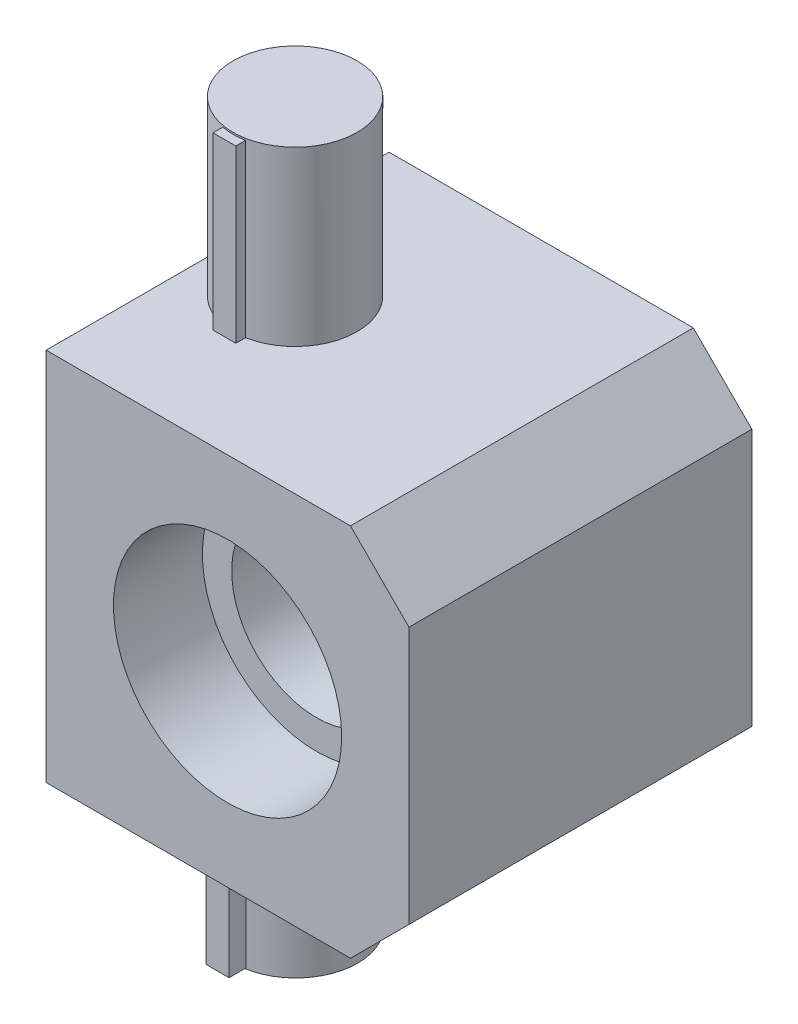
ISO-10303-21;
HEADER;
FILE_DESCRIPTION(('STEP AP214'),'2;1');
FILE_NAME('part.step','',(''),(''),'','','');
FILE_SCHEMA(('AUTOMOTIVE_DESIGN { 1 0 10303 214 1 1 1 1 }'));
ENDSEC;
DATA;
#1=APPLICATION_CONTEXT('core data for automotive mechanical design processes');
#2=APPLICATION_PROTOCOL_DEFINITION('international standard','automotive_design',2000,#1);
#3=PRODUCT_CONTEXT('',#1,'mechanical');
#4=PRODUCT('Part','Part','',(#3));
#5=PRODUCT_RELATED_PRODUCT_CATEGORY('part','',(#4));
#6=PRODUCT_DEFINITION_FORMATION('','',#4);
#7=PRODUCT_DEFINITION_CONTEXT('part definition',#1,'design');
#8=PRODUCT_DEFINITION('design','',#6,#7);
#9=PRODUCT_DEFINITION_SHAPE('','',#8);
#10=(LENGTH_UNIT() NAMED_UNIT(*) SI_UNIT(.MILLI.,.METRE.));
#11=(NAMED_UNIT(*) PLANE_ANGLE_UNIT() SI_UNIT($,.RADIAN.));
#12=(NAMED_UNIT(*) SI_UNIT($,.STERADIAN.) SOLID_ANGLE_UNIT());
#13=UNCERTAINTY_MEASURE_WITH_UNIT(LENGTH_MEASURE(1.E-05),#10,'distance_accuracy_value','');
#14=(GEOMETRIC_REPRESENTATION_CONTEXT(3) GLOBAL_UNCERTAINTY_ASSIGNED_CONTEXT((#13)) GLOBAL_UNIT_ASSIGNED_CONTEXT((#10,
#11,#12)) REPRESENTATION_CONTEXT('',''));
#15=CARTESIAN_POINT('',(0.,0.,0.));
#16=DIRECTION('',(0.,0.,1.));
#17=DIRECTION('',(1.,0.,0.));
#18=AXIS2_PLACEMENT_3D('',#15,#16,#17);
#19=CARTESIAN_POINT('',(3.1,-3.2,5.86));
#20=DIRECTION('',(0.,1.,0.));
#21=DIRECTION('',(-1.,0.,0.));
#22=AXIS2_PLACEMENT_3D('',#19,#20,#21);
#23=PLANE('',#22);
#24=DIRECTION('',(1.,0.,0.));
#25=VECTOR('',#24,1.);
#26=CARTESIAN_POINT('',(3.1,-3.2,0.));
#27=LINE('',#26,#25);
#28=CARTESIAN_POINT('',(-3.1,-3.2,0.));
#29=VERTEX_POINT('',#28);
#30=CARTESIAN_POINT('',(2.1,-3.2,0.));
#31=VERTEX_POINT('',#30);
#32=EDGE_CURVE('E258',#29,#31,#27,.T.);
#33=ORIENTED_EDGE('',*,*,#32,.T.);
#34=DIRECTION('',(0.,0.,1.));
#35=VECTOR('',#34,1.);
#36=CARTESIAN_POINT('',(2.1,-3.2,5.86));
#37=LINE('',#36,#35);
#38=CARTESIAN_POINT('',(2.1,-3.2,5.86));
#39=VERTEX_POINT('',#38);
#40=EDGE_CURVE('E223',#31,#39,#37,.T.);
#41=ORIENTED_EDGE('',*,*,#40,.T.);
#42=DIRECTION('',(1.,0.,0.));
#43=VECTOR('',#42,1.);
#44=CARTESIAN_POINT('',(3.1,-3.2,5.86));
#45=LINE('',#44,#43);
#46=CARTESIAN_POINT('',(-3.1,-3.2,5.86));
#47=VERTEX_POINT('',#46);
#48=EDGE_CURVE('E242',#47,#39,#45,.T.);
#49=ORIENTED_EDGE('',*,*,#48,.F.);
#50=DIRECTION('',(0.,0.,-1.));
#51=VECTOR('',#50,1.);
#52=CARTESIAN_POINT('',(-3.1,-3.2,5.86));
#53=LINE('',#52,#51);
#54=EDGE_CURVE('E271',#47,#29,#53,.T.);
#55=ORIENTED_EDGE('',*,*,#54,.T.);
#56=EDGE_LOOP('',(#33,#41,#49,#55));
#57=FACE_BOUND('',#56,.T.);
#58=DIRECTION('',(0.,0.,1.));
#59=VECTOR('',#58,1.);
#60=CARTESIAN_POINT('',(-1.56905023754,-3.2,3.71555524248292));
#61=LINE('',#60,#59);
#62=CARTESIAN_POINT('',(-1.56905023754,-3.2,3.97270153096788));
#63=VERTEX_POINT('',#62);
#64=CARTESIAN_POINT('',(-1.56905023754,-3.2,4.26602920930463));
#65=VERTEX_POINT('',#64);
#66=EDGE_CURVE('E170',#63,#65,#61,.T.);
#67=ORIENTED_EDGE('',*,*,#66,.F.);
#68=CARTESIAN_POINT('',(-1.76405023754,-3.2,2.93079222589378));
#69=DIRECTION('',(0.,-1.,0.));
#70=DIRECTION('',(1.,0.,0.));
#71=AXIS2_PLACEMENT_3D('',#68,#69,#70);
#72=CIRCLE('',#71,1.06);
#73=CARTESIAN_POINT('',(-1.95905023754,-3.2,3.97270153096788));
#74=VERTEX_POINT('',#73);
#75=EDGE_CURVE('E185',#74,#63,#72,.T.);
#76=ORIENTED_EDGE('',*,*,#75,.F.);
#77=DIRECTION('',(0.,0.,1.));
#78=VECTOR('',#77,1.);
#79=CARTESIAN_POINT('',(-1.95905023754,-3.2,3.71555524248292));
#80=LINE('',#79,#78);
#81=CARTESIAN_POINT('',(-1.95905023754,-3.2,4.26602920930463));
#82=VERTEX_POINT('',#81);
#83=EDGE_CURVE('E61',#74,#82,#80,.T.);
#84=ORIENTED_EDGE('',*,*,#83,.T.);
#85=DIRECTION('',(-1.,0.,0.));
#86=VECTOR('',#85,1.);
#87=CARTESIAN_POINT('',(-1.56905023754,-3.2,4.26602920930463));
#88=LINE('',#87,#86);
#89=EDGE_CURVE('E66',#65,#82,#88,.T.);
#90=ORIENTED_EDGE('',*,*,#89,.F.);
#91=EDGE_LOOP('',(#67,#76,#84,#90));
#92=FACE_BOUND('',#91,.T.);
#93=ADVANCED_FACE('F50',(#57,#92),#23,.F.);
#94=CARTESIAN_POINT('',(3.1,3.2,5.86));
#95=DIRECTION('',(0.,-1.,0.));
#96=DIRECTION('',(1.,0.,0.));
#97=AXIS2_PLACEMENT_3D('',#94,#95,#96);
#98=PLANE('',#97);
#99=DIRECTION('',(-1.,0.,0.));
#100=VECTOR('',#99,1.);
#101=CARTESIAN_POINT('',(3.1,3.2,5.86));
#102=LINE('',#101,#100);
#103=CARTESIAN_POINT('',(2.1,3.2,5.86));
#104=VERTEX_POINT('',#103);
#105=CARTESIAN_POINT('',(-3.1,3.2,5.86));
#106=VERTEX_POINT('',#105);
#107=EDGE_CURVE('E254',#104,#106,#102,.T.);
#108=ORIENTED_EDGE('',*,*,#107,.F.);
#109=DIRECTION('',(0.,0.,-1.));
#110=VECTOR('',#109,1.);
#111=CARTESIAN_POINT('',(2.1,3.2,5.86));
#112=LINE('',#111,#110);
#113=CARTESIAN_POINT('',(2.1,3.2,0.));
#114=VERTEX_POINT('',#113);
#115=EDGE_CURVE('E280',#104,#114,#112,.T.);
#116=ORIENTED_EDGE('',*,*,#115,.T.);
#117=DIRECTION('',(-1.,0.,0.));
#118=VECTOR('',#117,1.);
#119=CARTESIAN_POINT('',(3.1,3.2,0.));
#120=LINE('',#119,#118);
#121=CARTESIAN_POINT('',(-3.1,3.2,0.));
#122=VERTEX_POINT('',#121);
#123=EDGE_CURVE('E244',#114,#122,#120,.T.);
#124=ORIENTED_EDGE('',*,*,#123,.T.);
#125=DIRECTION('',(0.,0.,-1.));
#126=VECTOR('',#125,1.);
#127=CARTESIAN_POINT('',(-3.1,3.2,5.86));
#128=LINE('',#127,#126);
#129=EDGE_CURVE('E257',#106,#122,#128,.T.);
#130=ORIENTED_EDGE('',*,*,#129,.F.);
#131=EDGE_LOOP('',(#108,#116,#124,#130));
#132=FACE_BOUND('',#131,.T.);
#133=DIRECTION('',(0.,0.,-1.));
#134=VECTOR('',#133,1.);
#135=CARTESIAN_POINT('',(-1.5809854320758,3.2,3.84239832086676));
#136=LINE('',#135,#134);
#137=CARTESIAN_POINT('',(-1.5809854320758,3.2,4.13760167913324));
#138=VERTEX_POINT('',#137);
#139=CARTESIAN_POINT('',(-1.5809854320758,3.2,3.9719093050741));
#140=VERTEX_POINT('',#139);
#141=EDGE_CURVE('E180',#138,#140,#136,.T.);
#142=ORIENTED_EDGE('',*,*,#141,.F.);
#143=DIRECTION('',(1.,0.,0.));
#144=VECTOR('',#143,1.);
#145=CARTESIAN_POINT('',(-1.9709854320758,3.2,4.13760167913324));
#146=LINE('',#145,#144);
#147=CARTESIAN_POINT('',(-1.9709854320758,3.2,4.13760167913324));
#148=VERTEX_POINT('',#147);
#149=EDGE_CURVE('E195',#148,#138,#146,.T.);
#150=ORIENTED_EDGE('',*,*,#149,.F.);
#151=DIRECTION('',(0.,0.,1.));
#152=VECTOR('',#151,1.);
#153=CARTESIAN_POINT('',(-1.9709854320758,3.2,3.84239832086676));
#154=LINE('',#153,#152);
#155=CARTESIAN_POINT('',(-1.9709854320758,3.2,3.9719093050741));
#156=VERTEX_POINT('',#155);
#157=EDGE_CURVE('E201',#156,#148,#154,.T.);
#158=ORIENTED_EDGE('',*,*,#157,.F.);
#159=CARTESIAN_POINT('',(-1.7759854320758,3.2,2.93));
#160=DIRECTION('',(0.,1.,0.));
#161=DIRECTION('',(-1.,0.,0.));
#162=AXIS2_PLACEMENT_3D('',#159,#160,#161);
#163=CIRCLE('',#162,1.06);
#164=EDGE_CURVE('E219',#140,#156,#163,.T.);
#165=ORIENTED_EDGE('',*,*,#164,.F.);
#166=EDGE_LOOP('',(#142,#150,#158,#165));
#167=FACE_BOUND('',#166,.T.);
#168=ADVANCED_FACE('F330',(#132,#167),#98,.F.);
#169=CARTESIAN_POINT('',(-1.7759854320758,6.15,2.93));
#170=DIRECTION('',(0.,-1.,0.));
#171=DIRECTION('',(1.,0.,0.));
#172=AXIS2_PLACEMENT_3D('',#169,#170,#171);
#173=CYLINDRICAL_SURFACE('',#172,1.06);
#174=CARTESIAN_POINT('',(-1.7759854320758,6.15,2.93));
#175=DIRECTION('',(0.,1.,0.));
#176=DIRECTION('',(-1.,0.,0.));
#177=AXIS2_PLACEMENT_3D('',#174,#175,#176);
#178=CIRCLE('',#177,1.06);
#179=CARTESIAN_POINT('',(-2.8359854320758,6.15,2.93));
#180=VERTEX_POINT('',#179);
#181=EDGE_CURVE('E214',#180,#180,#178,.T.);
#182=ORIENTED_EDGE('',*,*,#181,.F.);
#183=EDGE_LOOP('',(#182));
#184=FACE_BOUND('',#183,.T.);
#185=DIRECTION('',(0.,-1.,0.));
#186=VECTOR('',#185,1.);
#187=CARTESIAN_POINT('',(-1.5809854320758,6.15,3.9719093050741));
#188=LINE('',#187,#186);
#189=CARTESIAN_POINT('',(-1.5809854320758,6.12,3.9719093050741));
#190=VERTEX_POINT('',#189);
#191=EDGE_CURVE('E190',#140,#190,#188,.F.);
#192=ORIENTED_EDGE('',*,*,#191,.F.);
#193=ORIENTED_EDGE('',*,*,#164,.T.);
#194=DIRECTION('',(0.,-1.,0.));
#195=VECTOR('',#194,1.);
#196=CARTESIAN_POINT('',(-1.9709854320758,6.15,3.9719093050741));
#197=LINE('',#196,#195);
#198=CARTESIAN_POINT('',(-1.9709854320758,6.12,3.9719093050741));
#199=VERTEX_POINT('',#198);
#200=EDGE_CURVE('E304',#199,#156,#197,.T.);
#201=ORIENTED_EDGE('',*,*,#200,.F.);
#202=CARTESIAN_POINT('',(-1.7759854320758,6.12,2.93));
#203=DIRECTION('',(0.,1.,0.));
#204=DIRECTION('',(0.,0.,1.));
#205=AXIS2_PLACEMENT_3D('',#202,#203,#204);
#206=CIRCLE('',#205,1.06);
#207=EDGE_CURVE('E225',#199,#190,#206,.T.);
#208=ORIENTED_EDGE('',*,*,#207,.T.);
#209=EDGE_LOOP('',(#192,#193,#201,#208));
#210=FACE_BOUND('',#209,.T.);
#211=ADVANCED_FACE('F334',(#184,#210),#173,.T.);
#212=CARTESIAN_POINT('',(-3.1,3.2,5.86));
#213=DIRECTION('',(1.,0.,0.));
#214=DIRECTION('',(0.,1.,0.));
#215=AXIS2_PLACEMENT_3D('',#212,#213,#214);
#216=PLANE('',#215);
#217=DIRECTION('',(0.,-1.,0.));
#218=VECTOR('',#217,1.);
#219=CARTESIAN_POINT('',(-3.1,3.2,0.));
#220=LINE('',#219,#218);
#221=EDGE_CURVE('E236',#122,#29,#220,.T.);
#222=ORIENTED_EDGE('',*,*,#221,.T.);
#223=ORIENTED_EDGE('',*,*,#54,.F.);
#224=DIRECTION('',(0.,-1.,0.));
#225=VECTOR('',#224,1.);
#226=CARTESIAN_POINT('',(-3.1,3.2,5.86));
#227=LINE('',#226,#225);
#228=EDGE_CURVE('E239',#106,#47,#227,.T.);
#229=ORIENTED_EDGE('',*,*,#228,.F.);
#230=ORIENTED_EDGE('',*,*,#129,.T.);
#231=EDGE_LOOP('',(#222,#223,#229,#230));
#232=FACE_BOUND('',#231,.T.);
#233=ADVANCED_FACE('F342',(#232),#216,.F.);
#234=CARTESIAN_POINT('',(3.1,3.2,5.86));
#235=DIRECTION('',(-1.,0.,0.));
#236=DIRECTION('',(0.,-1.,0.));
#237=AXIS2_PLACEMENT_3D('',#234,#235,#236);
#238=PLANE('',#237);
#239=DIRECTION('',(0.,1.,0.));
#240=VECTOR('',#239,1.);
#241=CARTESIAN_POINT('',(3.1,3.2,0.));
#242=LINE('',#241,#240);
#243=CARTESIAN_POINT('',(3.1,-2.2,0.));
#244=VERTEX_POINT('',#243);
#245=CARTESIAN_POINT('',(3.1,2.2,0.));
#246=VERTEX_POINT('',#245);
#247=EDGE_CURVE('E261',#244,#246,#242,.T.);
#248=ORIENTED_EDGE('',*,*,#247,.T.);
#249=DIRECTION('',(0.,0.,1.));
#250=VECTOR('',#249,1.);
#251=CARTESIAN_POINT('',(3.1,2.2,5.86));
#252=LINE('',#251,#250);
#253=CARTESIAN_POINT('',(3.1,2.2,5.86));
#254=VERTEX_POINT('',#253);
#255=EDGE_CURVE('E293',#246,#254,#252,.T.);
#256=ORIENTED_EDGE('',*,*,#255,.T.);
#257=DIRECTION('',(0.,1.,0.));
#258=VECTOR('',#257,1.);
#259=CARTESIAN_POINT('',(3.1,3.2,5.86));
#260=LINE('',#259,#258);
#261=CARTESIAN_POINT('',(3.1,-2.2,5.86));
#262=VERTEX_POINT('',#261);
#263=EDGE_CURVE('E248',#262,#254,#260,.T.);
#264=ORIENTED_EDGE('',*,*,#263,.F.);
#265=DIRECTION('',(0.,0.,-1.));
#266=VECTOR('',#265,1.);
#267=CARTESIAN_POINT('',(3.1,-2.2,5.86));
#268=LINE('',#267,#266);
#269=EDGE_CURVE('E290',#262,#244,#268,.T.);
#270=ORIENTED_EDGE('',*,*,#269,.T.);
#271=EDGE_LOOP('',(#248,#256,#264,#270));
#272=FACE_BOUND('',#271,.T.);
#273=ADVANCED_FACE('F338',(#272),#238,.F.);
#274=CARTESIAN_POINT('',(0.,0.,5.86));
#275=DIRECTION('',(0.,0.,-1.));
#276=DIRECTION('',(-1.,0.,0.));
#277=AXIS2_PLACEMENT_3D('',#274,#275,#276);
#278=PLANE('',#277);
#279=CARTESIAN_POINT('',(0.,0.,5.86));
#280=DIRECTION('',(0.,0.,1.));
#281=DIRECTION('',(1.,0.,0.));
#282=AXIS2_PLACEMENT_3D('',#279,#280,#281);
#283=CIRCLE('',#282,1.95);
#284=CARTESIAN_POINT('',(1.95,0.,5.86));
#285=VERTEX_POINT('',#284);
#286=EDGE_CURVE('E226',#285,#285,#283,.T.);
#287=ORIENTED_EDGE('',*,*,#286,.F.);
#288=EDGE_LOOP('',(#287));
#289=FACE_BOUND('',#288,.T.);
#290=ORIENTED_EDGE('',*,*,#263,.T.);
#291=DIRECTION('',(0.707106781186546,-0.707106781186549,0.));
#292=VECTOR('',#291,1.);
#293=CARTESIAN_POINT('',(2.1,3.2,5.86));
#294=LINE('',#293,#292);
#295=EDGE_CURVE('E300',#254,#104,#294,.F.);
#296=ORIENTED_EDGE('',*,*,#295,.T.);
#297=ORIENTED_EDGE('',*,*,#107,.T.);
#298=ORIENTED_EDGE('',*,*,#228,.T.);
#299=ORIENTED_EDGE('',*,*,#48,.T.);
#300=DIRECTION('',(-0.707106781186548,-0.707106781186547,0.));
#301=VECTOR('',#300,1.);
#302=CARTESIAN_POINT('',(3.1,-2.2,5.86));
#303=LINE('',#302,#301);
#304=EDGE_CURVE('E295',#39,#262,#303,.F.);
#305=ORIENTED_EDGE('',*,*,#304,.T.);
#306=EDGE_LOOP('',(#290,#296,#297,#298,#299,#305));
#307=FACE_BOUND('',#306,.T.);
#308=ADVANCED_FACE('F356',(#289,#307),#278,.F.);
#309=CARTESIAN_POINT('',(0.,0.,0.));
#310=DIRECTION('',(0.,0.,-1.));
#311=DIRECTION('',(-1.,0.,0.));
#312=AXIS2_PLACEMENT_3D('',#309,#310,#311);
#313=PLANE('',#312);
#314=CARTESIAN_POINT('',(0.,0.,0.));
#315=DIRECTION('',(0.,0.,1.));
#316=DIRECTION('',(1.,0.,0.));
#317=AXIS2_PLACEMENT_3D('',#314,#315,#316);
#318=CIRCLE('',#317,1.45);
#319=CARTESIAN_POINT('',(1.45,0.,0.));
#320=VERTEX_POINT('',#319);
#321=EDGE_CURVE('E222',#320,#320,#318,.T.);
#322=ORIENTED_EDGE('',*,*,#321,.T.);
#323=EDGE_LOOP('',(#322));
#324=FACE_BOUND('',#323,.T.);
#325=ORIENTED_EDGE('',*,*,#123,.F.);
#326=DIRECTION('',(-0.707106781186546,0.707106781186549,0.));
#327=VECTOR('',#326,1.);
#328=CARTESIAN_POINT('',(2.65,2.64999999999999,0.));
#329=LINE('',#328,#327);
#330=EDGE_CURVE('E281',#114,#246,#329,.F.);
#331=ORIENTED_EDGE('',*,*,#330,.T.);
#332=ORIENTED_EDGE('',*,*,#247,.F.);
#333=DIRECTION('',(0.707106781186548,0.707106781186547,0.));
#334=VECTOR('',#333,1.);
#335=CARTESIAN_POINT('',(2.65,-2.65,0.));
#336=LINE('',#335,#334);
#337=EDGE_CURVE('E282',#244,#31,#336,.F.);
#338=ORIENTED_EDGE('',*,*,#337,.T.);
#339=ORIENTED_EDGE('',*,*,#32,.F.);
#340=ORIENTED_EDGE('',*,*,#221,.F.);
#341=EDGE_LOOP('',(#325,#331,#332,#338,#339,#340));
#342=FACE_BOUND('',#341,.T.);
#343=ADVANCED_FACE('F346',(#324,#342),#313,.T.);
#344=CARTESIAN_POINT('',(2.1,3.2,5.86));
#345=DIRECTION('',(-0.707106781186549,-0.707106781186546,0.));
#346=DIRECTION('',(0.,0.,-1.));
#347=AXIS2_PLACEMENT_3D('',#344,#345,#346);
#348=PLANE('',#347);
#349=ORIENTED_EDGE('',*,*,#295,.F.);
#350=ORIENTED_EDGE('',*,*,#255,.F.);
#351=ORIENTED_EDGE('',*,*,#330,.F.);
#352=ORIENTED_EDGE('',*,*,#115,.F.);
#353=EDGE_LOOP('',(#349,#350,#351,#352));
#354=FACE_BOUND('',#353,.T.);
#355=ADVANCED_FACE('F343',(#354),#348,.F.);
#356=CARTESIAN_POINT('',(3.1,-2.2,5.86));
#357=DIRECTION('',(-0.707106781186547,0.707106781186548,0.));
#358=DIRECTION('',(0.,0.,-1.));
#359=AXIS2_PLACEMENT_3D('',#356,#357,#358);
#360=PLANE('',#359);
#361=ORIENTED_EDGE('',*,*,#304,.F.);
#362=ORIENTED_EDGE('',*,*,#40,.F.);
#363=ORIENTED_EDGE('',*,*,#337,.F.);
#364=ORIENTED_EDGE('',*,*,#269,.F.);
#365=EDGE_LOOP('',(#361,#362,#363,#364));
#366=FACE_BOUND('',#365,.T.);
#367=ADVANCED_FACE('F49',(#366),#360,.F.);
#368=CARTESIAN_POINT('',(0.,0.,4.34));
#369=DIRECTION('',(0.,0.,1.));
#370=DIRECTION('',(1.,0.,0.));
#371=AXIS2_PLACEMENT_3D('',#368,#369,#370);
#372=CYLINDRICAL_SURFACE('',#371,1.95);
#373=CARTESIAN_POINT('',(0.,0.,4.34));
#374=DIRECTION('',(0.,0.,1.));
#375=DIRECTION('',(1.,0.,0.));
#376=AXIS2_PLACEMENT_3D('',#373,#374,#375);
#377=CIRCLE('',#376,1.95);
#378=CARTESIAN_POINT('',(1.95,0.,4.34));
#379=VERTEX_POINT('',#378);
#380=EDGE_CURVE('E235',#379,#379,#377,.T.);
#381=ORIENTED_EDGE('',*,*,#380,.F.);
#382=EDGE_LOOP('',(#381));
#383=FACE_BOUND('',#382,.T.);
#384=ORIENTED_EDGE('',*,*,#286,.T.);
#385=EDGE_LOOP('',(#384));
#386=FACE_BOUND('',#385,.T.);
#387=ADVANCED_FACE('F354',(#383,#386),#372,.F.);
#388=CARTESIAN_POINT('',(0.,0.,4.34));
#389=DIRECTION('',(0.,0.,1.));
#390=DIRECTION('',(1.,0.,0.));
#391=AXIS2_PLACEMENT_3D('',#388,#389,#390);
#392=PLANE('',#391);
#393=CARTESIAN_POINT('',(0.,0.,4.34));
#394=DIRECTION('',(0.,0.,1.));
#395=DIRECTION('',(1.,0.,0.));
#396=AXIS2_PLACEMENT_3D('',#393,#394,#395);
#397=CIRCLE('',#396,1.45);
#398=CARTESIAN_POINT('',(1.45,0.,4.34));
#399=VERTEX_POINT('',#398);
#400=EDGE_CURVE('E220',#399,#399,#397,.T.);
#401=ORIENTED_EDGE('',*,*,#400,.F.);
#402=EDGE_LOOP('',(#401));
#403=FACE_BOUND('',#402,.T.);
#404=ORIENTED_EDGE('',*,*,#380,.T.);
#405=EDGE_LOOP('',(#404));
#406=FACE_BOUND('',#405,.T.);
#407=ADVANCED_FACE('F388',(#403,#406),#392,.T.);
#408=CARTESIAN_POINT('',(0.,0.,0.));
#409=DIRECTION('',(0.,0.,1.));
#410=DIRECTION('',(1.,0.,0.));
#411=AXIS2_PLACEMENT_3D('',#408,#409,#410);
#412=CYLINDRICAL_SURFACE('',#411,1.45);
#413=ORIENTED_EDGE('',*,*,#321,.F.);
#414=EDGE_LOOP('',(#413));
#415=FACE_BOUND('',#414,.T.);
#416=ORIENTED_EDGE('',*,*,#400,.T.);
#417=EDGE_LOOP('',(#416));
#418=FACE_BOUND('',#417,.T.);
#419=ADVANCED_FACE('F391',(#415,#418),#412,.F.);
#420=CARTESIAN_POINT('',(-1.7759854320758,6.15,2.93));
#421=DIRECTION('',(0.,1.,0.));
#422=DIRECTION('',(-1.,0.,0.));
#423=AXIS2_PLACEMENT_3D('',#420,#421,#422);
#424=PLANE('',#423);
#425=ORIENTED_EDGE('',*,*,#181,.T.);
#426=EDGE_LOOP('',(#425));
#427=FACE_BOUND('',#426,.T.);
#428=ADVANCED_FACE('F398',(#427),#424,.T.);
#429=CARTESIAN_POINT('',(-1.5809854320758,6.12,3.84239832086676));
#430=DIRECTION('',(-1.,0.,0.));
#431=DIRECTION('',(0.,-1.,0.));
#432=AXIS2_PLACEMENT_3D('',#429,#430,#431);
#433=PLANE('',#432);
#434=ORIENTED_EDGE('',*,*,#141,.T.);
#435=ORIENTED_EDGE('',*,*,#191,.T.);
#436=DIRECTION('',(0.,0.,-1.));
#437=VECTOR('',#436,1.);
#438=CARTESIAN_POINT('',(-1.5809854320758,6.12,3.84239832086676));
#439=LINE('',#438,#437);
#440=CARTESIAN_POINT('',(-1.5809854320758,6.12,4.13760167913324));
#441=VERTEX_POINT('',#440);
#442=EDGE_CURVE('E189',#441,#190,#439,.T.);
#443=ORIENTED_EDGE('',*,*,#442,.F.);
#444=DIRECTION('',(0.,-1.,0.));
#445=VECTOR('',#444,1.);
#446=CARTESIAN_POINT('',(-1.5809854320758,6.12,4.13760167913324));
#447=LINE('',#446,#445);
#448=EDGE_CURVE('E199',#441,#138,#447,.T.);
#449=ORIENTED_EDGE('',*,*,#448,.T.);
#450=EDGE_LOOP('',(#434,#435,#443,#449));
#451=FACE_BOUND('',#450,.T.);
#452=ADVANCED_FACE('F403',(#451),#433,.F.);
#453=CARTESIAN_POINT('',(-1.9709854320758,6.12,3.84239832086676));
#454=DIRECTION('',(1.,0.,0.));
#455=DIRECTION('',(0.,1.,0.));
#456=AXIS2_PLACEMENT_3D('',#453,#454,#455);
#457=PLANE('',#456);
#458=DIRECTION('',(0.,0.,1.));
#459=VECTOR('',#458,1.);
#460=CARTESIAN_POINT('',(-1.9709854320758,6.12,3.84239832086676));
#461=LINE('',#460,#459);
#462=CARTESIAN_POINT('',(-1.9709854320758,6.12,4.13760167913324));
#463=VERTEX_POINT('',#462);
#464=EDGE_CURVE('E192',#199,#463,#461,.T.);
#465=ORIENTED_EDGE('',*,*,#464,.F.);
#466=ORIENTED_EDGE('',*,*,#200,.T.);
#467=ORIENTED_EDGE('',*,*,#157,.T.);
#468=DIRECTION('',(0.,-1.,0.));
#469=VECTOR('',#468,1.);
#470=CARTESIAN_POINT('',(-1.9709854320758,6.12,4.13760167913324));
#471=LINE('',#470,#469);
#472=EDGE_CURVE('E209',#463,#148,#471,.T.);
#473=ORIENTED_EDGE('',*,*,#472,.F.);
#474=EDGE_LOOP('',(#465,#466,#467,#473));
#475=FACE_BOUND('',#474,.T.);
#476=ADVANCED_FACE('F406',(#475),#457,.F.);
#477=CARTESIAN_POINT('',(-1.9709854320758,6.12,4.13760167913324));
#478=DIRECTION('',(0.,0.,-1.));
#479=DIRECTION('',(-1.,0.,0.));
#480=AXIS2_PLACEMENT_3D('',#477,#478,#479);
#481=PLANE('',#480);
#482=ORIENTED_EDGE('',*,*,#149,.T.);
#483=ORIENTED_EDGE('',*,*,#448,.F.);
#484=DIRECTION('',(1.,0.,0.));
#485=VECTOR('',#484,1.);
#486=CARTESIAN_POINT('',(-1.9709854320758,6.12,4.13760167913324));
#487=LINE('',#486,#485);
#488=EDGE_CURVE('E193',#463,#441,#487,.T.);
#489=ORIENTED_EDGE('',*,*,#488,.F.);
#490=ORIENTED_EDGE('',*,*,#472,.T.);
#491=EDGE_LOOP('',(#482,#483,#489,#490));
#492=FACE_BOUND('',#491,.T.);
#493=ADVANCED_FACE('F414',(#492),#481,.F.);
#494=CARTESIAN_POINT('',(0.,6.12,0.));
#495=DIRECTION('',(0.,1.,0.));
#496=DIRECTION('',(0.,0.,1.));
#497=AXIS2_PLACEMENT_3D('',#494,#495,#496);
#498=PLANE('',#497);
#499=ORIENTED_EDGE('',*,*,#207,.F.);
#500=ORIENTED_EDGE('',*,*,#464,.T.);
#501=ORIENTED_EDGE('',*,*,#488,.T.);
#502=ORIENTED_EDGE('',*,*,#442,.T.);
#503=EDGE_LOOP('',(#499,#500,#501,#502));
#504=FACE_BOUND('',#503,.T.);
#505=ADVANCED_FACE('F420',(#504),#498,.T.);
#506=CARTESIAN_POINT('',(-1.76405023754,-6.14,2.93079222589378));
#507=DIRECTION('',(0.,1.,0.));
#508=DIRECTION('',(-1.,0.,0.));
#509=AXIS2_PLACEMENT_3D('',#506,#507,#508);
#510=CYLINDRICAL_SURFACE('',#509,1.06);
#511=CARTESIAN_POINT('',(-1.76405023754,-6.12,2.93079222589378));
#512=DIRECTION('',(0.,1.,0.));
#513=DIRECTION('',(0.,0.,1.));
#514=AXIS2_PLACEMENT_3D('',#511,#512,#513);
#515=CIRCLE('',#514,1.06);
#516=CARTESIAN_POINT('',(-1.95905023754,-6.12,3.97270153096788));
#517=VERTEX_POINT('',#516);
#518=CARTESIAN_POINT('',(-1.56905023754,-6.12,3.97270153096788));
#519=VERTEX_POINT('',#518);
#520=EDGE_CURVE('E187',#517,#519,#515,.T.);
#521=ORIENTED_EDGE('',*,*,#520,.F.);
#522=DIRECTION('',(0.,1.,0.));
#523=VECTOR('',#522,1.);
#524=CARTESIAN_POINT('',(-1.95905023754,-6.14,3.97270153096788));
#525=LINE('',#524,#523);
#526=EDGE_CURVE('E11',#517,#74,#525,.T.);
#527=ORIENTED_EDGE('',*,*,#526,.T.);
#528=ORIENTED_EDGE('',*,*,#75,.T.);
#529=DIRECTION('',(0.,1.,0.));
#530=VECTOR('',#529,1.);
#531=CARTESIAN_POINT('',(-1.56905023754,-6.14,3.97270153096788));
#532=LINE('',#531,#530);
#533=EDGE_CURVE('E60',#519,#63,#532,.T.);
#534=ORIENTED_EDGE('',*,*,#533,.F.);
#535=EDGE_LOOP('',(#521,#527,#528,#534));
#536=FACE_BOUND('',#535,.T.);
#537=CARTESIAN_POINT('',(-1.76405023754,-6.14,2.93079222589378));
#538=DIRECTION('',(0.,-1.,0.));
#539=DIRECTION('',(1.,0.,0.));
#540=AXIS2_PLACEMENT_3D('',#537,#538,#539);
#541=CIRCLE('',#540,1.06);
#542=CARTESIAN_POINT('',(-0.704050237540003,-6.14,2.93079222589378));
#543=VERTEX_POINT('',#542);
#544=EDGE_CURVE('E171',#543,#543,#541,.T.);
#545=ORIENTED_EDGE('',*,*,#544,.F.);
#546=EDGE_LOOP('',(#545));
#547=FACE_BOUND('',#546,.T.);
#548=ADVANCED_FACE('F320',(#536,#547),#510,.T.);
#549=CARTESIAN_POINT('',(-1.76405023754,-6.14,2.93079222589378));
#550=DIRECTION('',(0.,-1.,0.));
#551=DIRECTION('',(1.,0.,0.));
#552=AXIS2_PLACEMENT_3D('',#549,#550,#551);
#553=PLANE('',#552);
#554=ORIENTED_EDGE('',*,*,#544,.T.);
#555=EDGE_LOOP('',(#554));
#556=FACE_BOUND('',#555,.T.);
#557=ADVANCED_FACE('F421',(#556),#553,.T.);
#558=CARTESIAN_POINT('',(-1.95905023754,-6.12,3.71555524248292));
#559=DIRECTION('',(-1.,0.,0.));
#560=DIRECTION('',(0.,-1.,0.));
#561=AXIS2_PLACEMENT_3D('',#558,#559,#560);
#562=PLANE('',#561);
#563=ORIENTED_EDGE('',*,*,#526,.F.);
#564=DIRECTION('',(0.,0.,1.));
#565=VECTOR('',#564,1.);
#566=CARTESIAN_POINT('',(-1.95905023754,-6.12,3.71555524248292));
#567=LINE('',#566,#565);
#568=CARTESIAN_POINT('',(-1.95905023754,-6.12,4.26602920930463));
#569=VERTEX_POINT('',#568);
#570=EDGE_CURVE('E146',#517,#569,#567,.T.);
#571=ORIENTED_EDGE('',*,*,#570,.T.);
#572=DIRECTION('',(0.,1.,0.));
#573=VECTOR('',#572,1.);
#574=CARTESIAN_POINT('',(-1.95905023754,-6.12,4.26602920930463));
#575=LINE('',#574,#573);
#576=EDGE_CURVE('E154',#569,#82,#575,.T.);
#577=ORIENTED_EDGE('',*,*,#576,.T.);
#578=ORIENTED_EDGE('',*,*,#83,.F.);
#579=EDGE_LOOP('',(#563,#571,#577,#578));
#580=FACE_BOUND('',#579,.T.);
#581=ADVANCED_FACE('F152',(#580),#562,.T.);
#582=CARTESIAN_POINT('',(-1.56905023754,-6.12,3.71555524248292));
#583=DIRECTION('',(-1.,0.,0.));
#584=DIRECTION('',(0.,-1.,0.));
#585=AXIS2_PLACEMENT_3D('',#582,#583,#584);
#586=PLANE('',#585);
#587=DIRECTION('',(0.,0.,1.));
#588=VECTOR('',#587,1.);
#589=CARTESIAN_POINT('',(-1.56905023754,-6.12,3.71555524248292));
#590=LINE('',#589,#588);
#591=CARTESIAN_POINT('',(-1.56905023754,-6.12,4.26602920930463));
#592=VERTEX_POINT('',#591);
#593=EDGE_CURVE('E160',#519,#592,#590,.T.);
#594=ORIENTED_EDGE('',*,*,#593,.F.);
#595=ORIENTED_EDGE('',*,*,#533,.T.);
#596=ORIENTED_EDGE('',*,*,#66,.T.);
#597=DIRECTION('',(0.,1.,0.));
#598=VECTOR('',#597,1.);
#599=CARTESIAN_POINT('',(-1.56905023754,-6.12,4.26602920930463));
#600=LINE('',#599,#598);
#601=EDGE_CURVE('E175',#592,#65,#600,.T.);
#602=ORIENTED_EDGE('',*,*,#601,.F.);
#603=EDGE_LOOP('',(#594,#595,#596,#602));
#604=FACE_BOUND('',#603,.T.);
#605=ADVANCED_FACE('F314',(#604),#586,.F.);
#606=CARTESIAN_POINT('',(-1.56905023754,-6.12,4.26602920930463));
#607=DIRECTION('',(0.,0.,-1.));
#608=DIRECTION('',(-1.,0.,0.));
#609=AXIS2_PLACEMENT_3D('',#606,#607,#608);
#610=PLANE('',#609);
#611=ORIENTED_EDGE('',*,*,#89,.T.);
#612=ORIENTED_EDGE('',*,*,#576,.F.);
#613=DIRECTION('',(-1.,0.,0.));
#614=VECTOR('',#613,1.);
#615=CARTESIAN_POINT('',(-1.56905023754,-6.12,4.26602920930463));
#616=LINE('',#615,#614);
#617=EDGE_CURVE('E158',#592,#569,#616,.T.);
#618=ORIENTED_EDGE('',*,*,#617,.F.);
#619=ORIENTED_EDGE('',*,*,#601,.T.);
#620=EDGE_LOOP('',(#611,#612,#618,#619));
#621=FACE_BOUND('',#620,.T.);
#622=ADVANCED_FACE('F169',(#621),#610,.F.);
#623=CARTESIAN_POINT('',(0.,-6.12,0.));
#624=DIRECTION('',(0.,1.,0.));
#625=DIRECTION('',(0.,0.,1.));
#626=AXIS2_PLACEMENT_3D('',#623,#624,#625);
#627=PLANE('',#626);
#628=ORIENTED_EDGE('',*,*,#570,.F.);
#629=ORIENTED_EDGE('',*,*,#520,.T.);
#630=ORIENTED_EDGE('',*,*,#593,.T.);
#631=ORIENTED_EDGE('',*,*,#617,.T.);
#632=EDGE_LOOP('',(#628,#629,#630,#631));
#633=FACE_BOUND('',#632,.T.);
#634=ADVANCED_FACE('F163',(#633),#627,.F.);
#635=CLOSED_SHELL('',(#93,#168,#211,#233,#273,#308,#343,#355,#367,#387,#407,#419,#428,#452,#476,
#493,#505,#548,#557,#581,#605,#622,#634));
#636=MANIFOLD_SOLID_BREP('B2',#635);
#637=ADVANCED_BREP_SHAPE_REPRESENTATION('',(#18,#636),#14);
#638=SHAPE_DEFINITION_REPRESENTATION(#9,#637);
ENDSEC;
END-ISO-10303-21;
